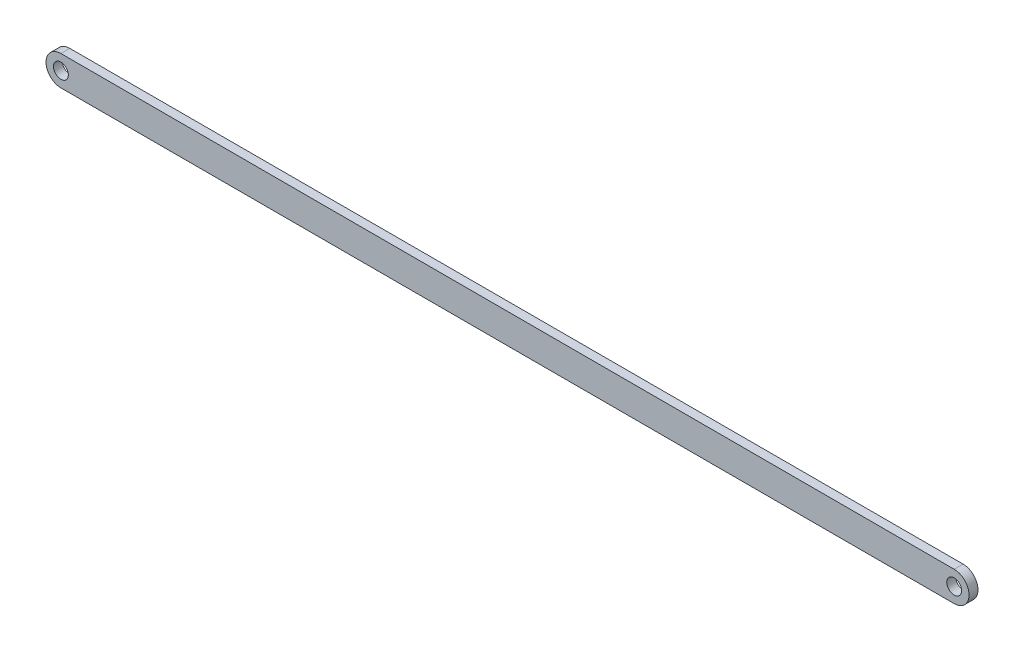
ISO-10303-21;
HEADER;
FILE_DESCRIPTION(('STEP AP214'),'2;1');
FILE_NAME('part.step','',(''),(''),'','','');
FILE_SCHEMA(('AUTOMOTIVE_DESIGN { 1 0 10303 214 1 1 1 1 }'));
ENDSEC;
DATA;
#1=APPLICATION_CONTEXT('core data for automotive mechanical design processes');
#2=APPLICATION_PROTOCOL_DEFINITION('international standard','automotive_design',2000,#1);
#3=PRODUCT_CONTEXT('',#1,'mechanical');
#4=PRODUCT('Part','Part','',(#3));
#5=PRODUCT_RELATED_PRODUCT_CATEGORY('part','',(#4));
#6=PRODUCT_DEFINITION_FORMATION('','',#4);
#7=PRODUCT_DEFINITION_CONTEXT('part definition',#1,'design');
#8=PRODUCT_DEFINITION('design','',#6,#7);
#9=PRODUCT_DEFINITION_SHAPE('','',#8);
#10=(LENGTH_UNIT() NAMED_UNIT(*) SI_UNIT(.MILLI.,.METRE.));
#11=(NAMED_UNIT(*) PLANE_ANGLE_UNIT() SI_UNIT($,.RADIAN.));
#12=(NAMED_UNIT(*) SI_UNIT($,.STERADIAN.) SOLID_ANGLE_UNIT());
#13=UNCERTAINTY_MEASURE_WITH_UNIT(LENGTH_MEASURE(1.E-05),#10,'distance_accuracy_value','');
#14=(GEOMETRIC_REPRESENTATION_CONTEXT(3) GLOBAL_UNCERTAINTY_ASSIGNED_CONTEXT((#13)) GLOBAL_UNIT_ASSIGNED_CONTEXT((#10,
#11,#12)) REPRESENTATION_CONTEXT('',''));
#15=CARTESIAN_POINT('',(0.,0.,0.));
#16=DIRECTION('',(0.,0.,1.));
#17=DIRECTION('',(1.,0.,0.));
#18=AXIS2_PLACEMENT_3D('',#15,#16,#17);
#19=CARTESIAN_POINT('',(-150.,0.,3.));
#20=DIRECTION('',(0.,0.,-1.));
#21=DIRECTION('',(-1.,0.,0.));
#22=AXIS2_PLACEMENT_3D('',#19,#20,#21);
#23=CYLINDRICAL_SURFACE('',#22,5.);
#24=CARTESIAN_POINT('',(-150.,0.,0.));
#25=DIRECTION('',(0.,0.,1.));
#26=DIRECTION('',(1.,0.,0.));
#27=AXIS2_PLACEMENT_3D('',#24,#25,#26);
#28=CIRCLE('',#27,5.);
#29=CARTESIAN_POINT('',(-150.,5.,0.));
#30=VERTEX_POINT('',#29);
#31=CARTESIAN_POINT('',(-150.,-5.,0.));
#32=VERTEX_POINT('',#31);
#33=EDGE_CURVE('E107',#30,#32,#28,.T.);
#34=ORIENTED_EDGE('',*,*,#33,.T.);
#35=DIRECTION('',(0.,0.,-1.));
#36=VECTOR('',#35,1.);
#37=CARTESIAN_POINT('',(-150.,-5.,3.));
#38=LINE('',#37,#36);
#39=CARTESIAN_POINT('',(-150.,-5.,3.));
#40=VERTEX_POINT('',#39);
#41=EDGE_CURVE('E11',#40,#32,#38,.T.);
#42=ORIENTED_EDGE('',*,*,#41,.F.);
#43=CARTESIAN_POINT('',(-150.,0.,3.));
#44=DIRECTION('',(0.,0.,1.));
#45=DIRECTION('',(1.,0.,0.));
#46=AXIS2_PLACEMENT_3D('',#43,#44,#45);
#47=CIRCLE('',#46,5.);
#48=CARTESIAN_POINT('',(-150.,5.,3.));
#49=VERTEX_POINT('',#48);
#50=EDGE_CURVE('E91',#49,#40,#47,.T.);
#51=ORIENTED_EDGE('',*,*,#50,.F.);
#52=DIRECTION('',(0.,0.,-1.));
#53=VECTOR('',#52,1.);
#54=CARTESIAN_POINT('',(-150.,5.,3.));
#55=LINE('',#54,#53);
#56=EDGE_CURVE('E103',#49,#30,#55,.T.);
#57=ORIENTED_EDGE('',*,*,#56,.T.);
#58=EDGE_LOOP('',(#34,#42,#51,#57));
#59=FACE_BOUND('',#58,.T.);
#60=ADVANCED_FACE('F39',(#59),#23,.T.);
#61=CARTESIAN_POINT('',(-150.,-5.,3.));
#62=DIRECTION('',(0.,1.,0.));
#63=DIRECTION('',(-1.,0.,0.));
#64=AXIS2_PLACEMENT_3D('',#61,#62,#63);
#65=PLANE('',#64);
#66=DIRECTION('',(1.,0.,0.));
#67=VECTOR('',#66,1.);
#68=CARTESIAN_POINT('',(-150.,-5.,0.));
#69=LINE('',#68,#67);
#70=CARTESIAN_POINT('',(150.,-4.99999999999995,0.));
#71=VERTEX_POINT('',#70);
#72=EDGE_CURVE('E96',#32,#71,#69,.T.);
#73=ORIENTED_EDGE('',*,*,#72,.T.);
#74=DIRECTION('',(0.,0.,-1.));
#75=VECTOR('',#74,1.);
#76=CARTESIAN_POINT('',(150.,-4.99999999999995,3.));
#77=LINE('',#76,#75);
#78=CARTESIAN_POINT('',(150.,-4.99999999999995,3.));
#79=VERTEX_POINT('',#78);
#80=EDGE_CURVE('E48',#79,#71,#77,.T.);
#81=ORIENTED_EDGE('',*,*,#80,.F.);
#82=DIRECTION('',(1.,0.,0.));
#83=VECTOR('',#82,1.);
#84=CARTESIAN_POINT('',(-150.,-5.,3.));
#85=LINE('',#84,#83);
#86=EDGE_CURVE('E86',#40,#79,#85,.T.);
#87=ORIENTED_EDGE('',*,*,#86,.F.);
#88=ORIENTED_EDGE('',*,*,#41,.T.);
#89=EDGE_LOOP('',(#73,#81,#87,#88));
#90=FACE_BOUND('',#89,.T.);
#91=ADVANCED_FACE('F95',(#90),#65,.F.);
#92=CARTESIAN_POINT('',(150.,0.,3.));
#93=DIRECTION('',(0.,0.,-1.));
#94=DIRECTION('',(-1.,0.,0.));
#95=AXIS2_PLACEMENT_3D('',#92,#93,#94);
#96=CYLINDRICAL_SURFACE('',#95,5.);
#97=CARTESIAN_POINT('',(150.,0.,0.));
#98=DIRECTION('',(0.,0.,1.));
#99=DIRECTION('',(1.,0.,0.));
#100=AXIS2_PLACEMENT_3D('',#97,#98,#99);
#101=CIRCLE('',#100,5.);
#102=CARTESIAN_POINT('',(150.,5.00000000000006,0.));
#103=VERTEX_POINT('',#102);
#104=EDGE_CURVE('E73',#71,#103,#101,.T.);
#105=ORIENTED_EDGE('',*,*,#104,.T.);
#106=DIRECTION('',(0.,0.,-1.));
#107=VECTOR('',#106,1.);
#108=CARTESIAN_POINT('',(150.,5.00000000000006,3.));
#109=LINE('',#108,#107);
#110=CARTESIAN_POINT('',(150.,5.00000000000006,3.));
#111=VERTEX_POINT('',#110);
#112=EDGE_CURVE('E98',#111,#103,#109,.T.);
#113=ORIENTED_EDGE('',*,*,#112,.F.);
#114=CARTESIAN_POINT('',(150.,0.,3.));
#115=DIRECTION('',(0.,0.,1.));
#116=DIRECTION('',(1.,0.,0.));
#117=AXIS2_PLACEMENT_3D('',#114,#115,#116);
#118=CIRCLE('',#117,5.);
#119=EDGE_CURVE('E89',#79,#111,#118,.T.);
#120=ORIENTED_EDGE('',*,*,#119,.F.);
#121=ORIENTED_EDGE('',*,*,#80,.T.);
#122=EDGE_LOOP('',(#105,#113,#120,#121));
#123=FACE_BOUND('',#122,.T.);
#124=ADVANCED_FACE('F99',(#123),#96,.T.);
#125=CARTESIAN_POINT('',(-150.,5.,3.));
#126=DIRECTION('',(0.,-1.,0.));
#127=DIRECTION('',(1.,0.,0.));
#128=AXIS2_PLACEMENT_3D('',#125,#126,#127);
#129=PLANE('',#128);
#130=DIRECTION('',(-1.,0.,0.));
#131=VECTOR('',#130,1.);
#132=CARTESIAN_POINT('',(-150.,5.,0.));
#133=LINE('',#132,#131);
#134=EDGE_CURVE('E79',#103,#30,#133,.T.);
#135=ORIENTED_EDGE('',*,*,#134,.T.);
#136=ORIENTED_EDGE('',*,*,#56,.F.);
#137=DIRECTION('',(-1.,0.,0.));
#138=VECTOR('',#137,1.);
#139=CARTESIAN_POINT('',(-150.,5.,3.));
#140=LINE('',#139,#138);
#141=EDGE_CURVE('E56',#111,#49,#140,.T.);
#142=ORIENTED_EDGE('',*,*,#141,.F.);
#143=ORIENTED_EDGE('',*,*,#112,.T.);
#144=EDGE_LOOP('',(#135,#136,#142,#143));
#145=FACE_BOUND('',#144,.T.);
#146=ADVANCED_FACE('F121',(#145),#129,.F.);
#147=CARTESIAN_POINT('',(-150.,0.,3.));
#148=DIRECTION('',(0.,0.,1.));
#149=DIRECTION('',(1.,0.,0.));
#150=AXIS2_PLACEMENT_3D('',#147,#148,#149);
#151=PLANE('',#150);
#152=CARTESIAN_POINT('',(150.,0.,3.));
#153=DIRECTION('',(0.,0.,-1.));
#154=DIRECTION('',(-1.,0.,0.));
#155=AXIS2_PLACEMENT_3D('',#152,#153,#154);
#156=CIRCLE('',#155,2.5);
#157=CARTESIAN_POINT('',(152.5,0.,3.));
#158=VERTEX_POINT('',#157);
#159=EDGE_CURVE('E135',#158,#158,#156,.T.);
#160=ORIENTED_EDGE('',*,*,#159,.T.);
#161=EDGE_LOOP('',(#160));
#162=FACE_BOUND('',#161,.T.);
#163=CARTESIAN_POINT('',(-150.,0.,3.));
#164=DIRECTION('',(0.,0.,1.));
#165=DIRECTION('',(1.,0.,0.));
#166=AXIS2_PLACEMENT_3D('',#163,#164,#165);
#167=CIRCLE('',#166,2.5);
#168=CARTESIAN_POINT('',(-147.5,0.,3.));
#169=VERTEX_POINT('',#168);
#170=EDGE_CURVE('E131',#169,#169,#167,.T.);
#171=ORIENTED_EDGE('',*,*,#170,.F.);
#172=EDGE_LOOP('',(#171));
#173=FACE_BOUND('',#172,.T.);
#174=ORIENTED_EDGE('',*,*,#50,.T.);
#175=ORIENTED_EDGE('',*,*,#86,.T.);
#176=ORIENTED_EDGE('',*,*,#119,.T.);
#177=ORIENTED_EDGE('',*,*,#141,.T.);
#178=EDGE_LOOP('',(#174,#175,#176,#177));
#179=FACE_BOUND('',#178,.T.);
#180=ADVANCED_FACE('F87',(#162,#173,#179),#151,.T.);
#181=CARTESIAN_POINT('',(-150.,0.,0.));
#182=DIRECTION('',(0.,0.,1.));
#183=DIRECTION('',(1.,0.,0.));
#184=AXIS2_PLACEMENT_3D('',#181,#182,#183);
#185=PLANE('',#184);
#186=CARTESIAN_POINT('',(150.,0.,0.));
#187=DIRECTION('',(0.,0.,1.));
#188=DIRECTION('',(1.,0.,0.));
#189=AXIS2_PLACEMENT_3D('',#186,#187,#188);
#190=CIRCLE('',#189,2.5);
#191=CARTESIAN_POINT('',(152.5,0.,0.));
#192=VERTEX_POINT('',#191);
#193=EDGE_CURVE('E136',#192,#192,#190,.T.);
#194=ORIENTED_EDGE('',*,*,#193,.T.);
#195=EDGE_LOOP('',(#194));
#196=FACE_BOUND('',#195,.T.);
#197=CARTESIAN_POINT('',(-150.,0.,0.));
#198=DIRECTION('',(0.,0.,1.));
#199=DIRECTION('',(1.,0.,0.));
#200=AXIS2_PLACEMENT_3D('',#197,#198,#199);
#201=CIRCLE('',#200,2.5);
#202=CARTESIAN_POINT('',(-147.5,0.,0.));
#203=VERTEX_POINT('',#202);
#204=EDGE_CURVE('E111',#203,#203,#201,.F.);
#205=ORIENTED_EDGE('',*,*,#204,.F.);
#206=EDGE_LOOP('',(#205));
#207=FACE_BOUND('',#206,.T.);
#208=ORIENTED_EDGE('',*,*,#33,.F.);
#209=ORIENTED_EDGE('',*,*,#134,.F.);
#210=ORIENTED_EDGE('',*,*,#104,.F.);
#211=ORIENTED_EDGE('',*,*,#72,.F.);
#212=EDGE_LOOP('',(#208,#209,#210,#211));
#213=FACE_BOUND('',#212,.T.);
#214=ADVANCED_FACE('F124',(#196,#207,#213),#185,.F.);
#215=CARTESIAN_POINT('',(-150.,0.,-0.00100000000000013));
#216=DIRECTION('',(0.,0.,1.));
#217=DIRECTION('',(1.,0.,0.));
#218=AXIS2_PLACEMENT_3D('',#215,#216,#217);
#219=CYLINDRICAL_SURFACE('',#218,2.5);
#220=CARTESIAN_POINT('',(-147.5,0.,3.));
#221=CARTESIAN_POINT('',(-147.5,0.,2.96875));
#222=CARTESIAN_POINT('',(-147.5,0.,2.9375));
#223=CARTESIAN_POINT('',(-147.5,0.,2.875));
#224=CARTESIAN_POINT('',(-147.5,0.,2.84375));
#225=CARTESIAN_POINT('',(-147.5,0.,2.78125));
#226=CARTESIAN_POINT('',(-147.5,0.,2.75));
#227=CARTESIAN_POINT('',(-147.5,0.,2.6875));
#228=CARTESIAN_POINT('',(-147.5,0.,2.65625));
#229=CARTESIAN_POINT('',(-147.5,0.,2.59375));
#230=CARTESIAN_POINT('',(-147.5,0.,2.5625));
#231=CARTESIAN_POINT('',(-147.5,0.,2.5));
#232=CARTESIAN_POINT('',(-147.5,0.,2.46875));
#233=CARTESIAN_POINT('',(-147.5,0.,2.40625));
#234=CARTESIAN_POINT('',(-147.5,0.,2.375));
#235=CARTESIAN_POINT('',(-147.5,0.,2.3125));
#236=CARTESIAN_POINT('',(-147.5,0.,2.28125));
#237=CARTESIAN_POINT('',(-147.5,0.,2.21875));
#238=CARTESIAN_POINT('',(-147.5,0.,2.1875));
#239=CARTESIAN_POINT('',(-147.5,0.,2.125));
#240=CARTESIAN_POINT('',(-147.5,0.,2.09375));
#241=CARTESIAN_POINT('',(-147.5,0.,2.03125));
#242=CARTESIAN_POINT('',(-147.5,0.,2.));
#243=CARTESIAN_POINT('',(-147.5,0.,1.9375));
#244=CARTESIAN_POINT('',(-147.5,0.,1.90625));
#245=CARTESIAN_POINT('',(-147.5,0.,1.84375));
#246=CARTESIAN_POINT('',(-147.5,0.,1.8125));
#247=CARTESIAN_POINT('',(-147.5,0.,1.75));
#248=CARTESIAN_POINT('',(-147.5,0.,1.71875));
#249=CARTESIAN_POINT('',(-147.5,0.,1.65625));
#250=CARTESIAN_POINT('',(-147.5,0.,1.625));
#251=CARTESIAN_POINT('',(-147.5,0.,1.5625));
#252=CARTESIAN_POINT('',(-147.5,0.,1.53125));
#253=CARTESIAN_POINT('',(-147.5,0.,1.46875));
#254=CARTESIAN_POINT('',(-147.5,0.,1.4375));
#255=CARTESIAN_POINT('',(-147.5,0.,1.375));
#256=CARTESIAN_POINT('',(-147.5,0.,1.34375));
#257=CARTESIAN_POINT('',(-147.5,0.,1.28125));
#258=CARTESIAN_POINT('',(-147.5,0.,1.25));
#259=CARTESIAN_POINT('',(-147.5,0.,1.1875));
#260=CARTESIAN_POINT('',(-147.5,0.,1.15625));
#261=CARTESIAN_POINT('',(-147.5,0.,1.09375));
#262=CARTESIAN_POINT('',(-147.5,0.,1.0625));
#263=CARTESIAN_POINT('',(-147.5,0.,1.));
#264=CARTESIAN_POINT('',(-147.5,0.,0.96875));
#265=CARTESIAN_POINT('',(-147.5,0.,0.90625));
#266=CARTESIAN_POINT('',(-147.5,0.,0.875));
#267=CARTESIAN_POINT('',(-147.5,0.,0.8125));
#268=CARTESIAN_POINT('',(-147.5,0.,0.78125));
#269=CARTESIAN_POINT('',(-147.5,0.,0.71875));
#270=CARTESIAN_POINT('',(-147.5,0.,0.6875));
#271=CARTESIAN_POINT('',(-147.5,0.,0.625));
#272=CARTESIAN_POINT('',(-147.5,0.,0.59375));
#273=CARTESIAN_POINT('',(-147.5,0.,0.53125));
#274=CARTESIAN_POINT('',(-147.5,0.,0.5));
#275=CARTESIAN_POINT('',(-147.5,0.,0.4375));
#276=CARTESIAN_POINT('',(-147.5,0.,0.40625));
#277=CARTESIAN_POINT('',(-147.5,0.,0.34375));
#278=CARTESIAN_POINT('',(-147.5,0.,0.3125));
#279=CARTESIAN_POINT('',(-147.5,0.,0.25));
#280=CARTESIAN_POINT('',(-147.5,0.,0.21875));
#281=CARTESIAN_POINT('',(-147.5,0.,0.15625));
#282=CARTESIAN_POINT('',(-147.5,0.,0.125));
#283=CARTESIAN_POINT('',(-147.5,0.,0.0625000000000001));
#284=CARTESIAN_POINT('',(-147.5,0.,0.0312500000000001));
#285=CARTESIAN_POINT('',(-147.5,0.,0.));
#286=B_SPLINE_CURVE_WITH_KNOTS('',3,(#220,#221,#222,#223,#224,#225,#226,#227,#228,#229,#230,
#231,#232,#233,#234,#235,#236,#237,#238,#239,#240,#241,#242,#243,#244,#245,#246,#247,#248,#249,
#250,#251,#252,#253,#254,#255,#256,#257,#258,#259,#260,#261,#262,#263,#264,#265,#266,#267,#268,
#269,#270,#271,#272,#273,#274,#275,#276,#277,#278,#279,#280,#281,#282,#283,#284,#285),
.UNSPECIFIED.,.F.,.F.,(4,2,2,2,2,2,2,2,2,2,2,2,2,2,2,2,2,2,2,2,2,2,2,2,2,2,2,2,2,2,2,2,4),(0.,
0.0937500000000001,0.1875,0.28125,0.375,0.46875,0.5625,0.65625,0.75,0.84375,0.9375,1.03125,
1.125,1.21875,1.3125,1.40625,1.5,1.59375,1.6875,1.78125,1.875,1.96875,2.0625,2.15625,2.25,
2.34375,2.4375,2.53125,2.625,2.71875,2.8125,2.90625,3.),.UNSPECIFIED.);
#287=EDGE_CURVE('BSEAM149',#169,#203,#286,.T.);
#288=ORIENTED_EDGE('',*,*,#170,.T.);
#289=ORIENTED_EDGE('',*,*,#204,.T.);
#290=ORIENTED_EDGE('',*,*,#287,.T.);
#291=ORIENTED_EDGE('',*,*,#287,.F.);
#292=EDGE_LOOP('',(#288,#290,#289,#291));
#293=FACE_BOUND('',#292,.T.);
#294=ADVANCED_FACE('F149',(#293),#219,.F.);
#295=CARTESIAN_POINT('',(150.,0.,-0.00100000000000013));
#296=DIRECTION('',(0.,0.,1.));
#297=DIRECTION('',(1.,0.,0.));
#298=AXIS2_PLACEMENT_3D('',#295,#296,#297);
#299=CYLINDRICAL_SURFACE('',#298,2.5);
#300=CARTESIAN_POINT('',(152.5,0.,3.));
#301=CARTESIAN_POINT('',(152.5,0.,2.96875));
#302=CARTESIAN_POINT('',(152.5,0.,2.9375));
#303=CARTESIAN_POINT('',(152.5,0.,2.875));
#304=CARTESIAN_POINT('',(152.5,0.,2.84375));
#305=CARTESIAN_POINT('',(152.5,0.,2.78125));
#306=CARTESIAN_POINT('',(152.5,0.,2.75));
#307=CARTESIAN_POINT('',(152.5,0.,2.6875));
#308=CARTESIAN_POINT('',(152.5,0.,2.65625));
#309=CARTESIAN_POINT('',(152.5,0.,2.59375));
#310=CARTESIAN_POINT('',(152.5,0.,2.5625));
#311=CARTESIAN_POINT('',(152.5,0.,2.5));
#312=CARTESIAN_POINT('',(152.5,0.,2.46875));
#313=CARTESIAN_POINT('',(152.5,0.,2.40625));
#314=CARTESIAN_POINT('',(152.5,0.,2.375));
#315=CARTESIAN_POINT('',(152.5,0.,2.3125));
#316=CARTESIAN_POINT('',(152.5,0.,2.28125));
#317=CARTESIAN_POINT('',(152.5,0.,2.21875));
#318=CARTESIAN_POINT('',(152.5,0.,2.1875));
#319=CARTESIAN_POINT('',(152.5,0.,2.125));
#320=CARTESIAN_POINT('',(152.5,0.,2.09375));
#321=CARTESIAN_POINT('',(152.5,0.,2.03125));
#322=CARTESIAN_POINT('',(152.5,0.,2.));
#323=CARTESIAN_POINT('',(152.5,0.,1.9375));
#324=CARTESIAN_POINT('',(152.5,0.,1.90625));
#325=CARTESIAN_POINT('',(152.5,0.,1.84375));
#326=CARTESIAN_POINT('',(152.5,0.,1.8125));
#327=CARTESIAN_POINT('',(152.5,0.,1.75));
#328=CARTESIAN_POINT('',(152.5,0.,1.71875));
#329=CARTESIAN_POINT('',(152.5,0.,1.65625));
#330=CARTESIAN_POINT('',(152.5,0.,1.625));
#331=CARTESIAN_POINT('',(152.5,0.,1.5625));
#332=CARTESIAN_POINT('',(152.5,0.,1.53125));
#333=CARTESIAN_POINT('',(152.5,0.,1.46875));
#334=CARTESIAN_POINT('',(152.5,0.,1.4375));
#335=CARTESIAN_POINT('',(152.5,0.,1.375));
#336=CARTESIAN_POINT('',(152.5,0.,1.34375));
#337=CARTESIAN_POINT('',(152.5,0.,1.28125));
#338=CARTESIAN_POINT('',(152.5,0.,1.25));
#339=CARTESIAN_POINT('',(152.5,0.,1.1875));
#340=CARTESIAN_POINT('',(152.5,0.,1.15625));
#341=CARTESIAN_POINT('',(152.5,0.,1.09375));
#342=CARTESIAN_POINT('',(152.5,0.,1.0625));
#343=CARTESIAN_POINT('',(152.5,0.,1.));
#344=CARTESIAN_POINT('',(152.5,0.,0.96875));
#345=CARTESIAN_POINT('',(152.5,0.,0.90625));
#346=CARTESIAN_POINT('',(152.5,0.,0.875));
#347=CARTESIAN_POINT('',(152.5,0.,0.8125));
#348=CARTESIAN_POINT('',(152.5,0.,0.78125));
#349=CARTESIAN_POINT('',(152.5,0.,0.71875));
#350=CARTESIAN_POINT('',(152.5,0.,0.6875));
#351=CARTESIAN_POINT('',(152.5,0.,0.625));
#352=CARTESIAN_POINT('',(152.5,0.,0.59375));
#353=CARTESIAN_POINT('',(152.5,0.,0.53125));
#354=CARTESIAN_POINT('',(152.5,0.,0.5));
#355=CARTESIAN_POINT('',(152.5,0.,0.4375));
#356=CARTESIAN_POINT('',(152.5,0.,0.40625));
#357=CARTESIAN_POINT('',(152.5,0.,0.34375));
#358=CARTESIAN_POINT('',(152.5,0.,0.3125));
#359=CARTESIAN_POINT('',(152.5,0.,0.25));
#360=CARTESIAN_POINT('',(152.5,0.,0.21875));
#361=CARTESIAN_POINT('',(152.5,0.,0.15625));
#362=CARTESIAN_POINT('',(152.5,0.,0.125));
#363=CARTESIAN_POINT('',(152.5,0.,0.0625000000000001));
#364=CARTESIAN_POINT('',(152.5,0.,0.03125));
#365=CARTESIAN_POINT('',(152.5,0.,0.));
#366=B_SPLINE_CURVE_WITH_KNOTS('',3,(#300,#301,#302,#303,#304,#305,#306,#307,#308,#309,#310,
#311,#312,#313,#314,#315,#316,#317,#318,#319,#320,#321,#322,#323,#324,#325,#326,#327,#328,#329,
#330,#331,#332,#333,#334,#335,#336,#337,#338,#339,#340,#341,#342,#343,#344,#345,#346,#347,#348,
#349,#350,#351,#352,#353,#354,#355,#356,#357,#358,#359,#360,#361,#362,#363,#364,#365),
.UNSPECIFIED.,.F.,.F.,(4,2,2,2,2,2,2,2,2,2,2,2,2,2,2,2,2,2,2,2,2,2,2,2,2,2,2,2,2,2,2,2,4),(0.,
0.0937500000000001,0.1875,0.28125,0.375,0.46875,0.5625,0.65625,0.75,0.84375,0.9375,1.03125,
1.125,1.21875,1.3125,1.40625,1.5,1.59375,1.6875,1.78125,1.875,1.96875,2.0625,2.15625,2.25,
2.34375,2.4375,2.53125,2.625,2.71875,2.8125,2.90625,3.),.UNSPECIFIED.);
#367=EDGE_CURVE('BSEAM146',#158,#192,#366,.T.);
#368=ORIENTED_EDGE('',*,*,#159,.F.);
#369=ORIENTED_EDGE('',*,*,#193,.F.);
#370=ORIENTED_EDGE('',*,*,#367,.T.);
#371=ORIENTED_EDGE('',*,*,#367,.F.);
#372=EDGE_LOOP('',(#368,#370,#369,#371));
#373=FACE_BOUND('',#372,.T.);
#374=ADVANCED_FACE('F146',(#373),#299,.F.);
#375=CLOSED_SHELL('',(#60,#91,#124,#146,#180,#214,#294,#374));
#376=MANIFOLD_SOLID_BREP('B2',#375);
#377=ADVANCED_BREP_SHAPE_REPRESENTATION('',(#18,#376),#14);
#378=SHAPE_DEFINITION_REPRESENTATION(#9,#377);
ENDSEC;
END-ISO-10303-21;
